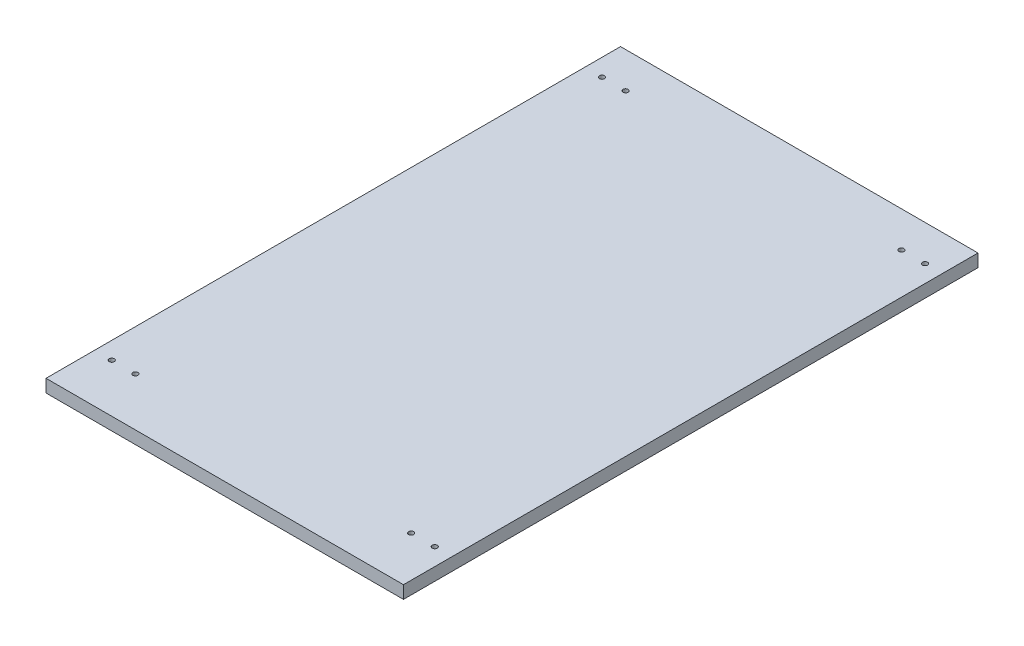
ISO-10303-21;
HEADER;
FILE_DESCRIPTION(('STEP AP214'),'2;1');
FILE_NAME('part.step','',(''),(''),'','','');
FILE_SCHEMA(('AUTOMOTIVE_DESIGN { 1 0 10303 214 1 1 1 1 }'));
ENDSEC;
DATA;
#1=APPLICATION_CONTEXT('core data for automotive mechanical design processes');
#2=APPLICATION_PROTOCOL_DEFINITION('international standard','automotive_design',2000,#1);
#3=PRODUCT_CONTEXT('',#1,'mechanical');
#4=PRODUCT('Part','Part','',(#3));
#5=PRODUCT_RELATED_PRODUCT_CATEGORY('part','',(#4));
#6=PRODUCT_DEFINITION_FORMATION('','',#4);
#7=PRODUCT_DEFINITION_CONTEXT('part definition',#1,'design');
#8=PRODUCT_DEFINITION('design','',#6,#7);
#9=PRODUCT_DEFINITION_SHAPE('','',#8);
#10=(LENGTH_UNIT() NAMED_UNIT(*) SI_UNIT(.MILLI.,.METRE.));
#11=(NAMED_UNIT(*) PLANE_ANGLE_UNIT() SI_UNIT($,.RADIAN.));
#12=(NAMED_UNIT(*) SI_UNIT($,.STERADIAN.) SOLID_ANGLE_UNIT());
#13=UNCERTAINTY_MEASURE_WITH_UNIT(LENGTH_MEASURE(1.E-05),#10,'distance_accuracy_value','');
#14=(GEOMETRIC_REPRESENTATION_CONTEXT(3) GLOBAL_UNCERTAINTY_ASSIGNED_CONTEXT((#13)) GLOBAL_UNIT_ASSIGNED_CONTEXT((#10,
#11,#12)) REPRESENTATION_CONTEXT('',''));
#15=CARTESIAN_POINT('',(0.,0.,0.));
#16=DIRECTION('',(0.,0.,1.));
#17=DIRECTION('',(1.,0.,0.));
#18=AXIS2_PLACEMENT_3D('',#15,#16,#17);
#19=CARTESIAN_POINT('',(0.,10.,0.));
#20=DIRECTION('',(-1.,0.,0.));
#21=DIRECTION('',(0.,0.,1.));
#22=AXIS2_PLACEMENT_3D('',#19,#20,#21);
#23=PLANE('',#22);
#24=DIRECTION('',(0.,0.,-1.));
#25=VECTOR('',#24,1.);
#26=CARTESIAN_POINT('',(0.,0.,0.));
#27=LINE('',#26,#25);
#28=CARTESIAN_POINT('',(0.,0.,0.));
#29=VERTEX_POINT('',#28);
#30=CARTESIAN_POINT('',(0.,0.,-450.));
#31=VERTEX_POINT('',#30);
#32=EDGE_CURVE('E100',#29,#31,#27,.T.);
#33=ORIENTED_EDGE('',*,*,#32,.T.);
#34=DIRECTION('',(0.,-1.,0.));
#35=VECTOR('',#34,1.);
#36=CARTESIAN_POINT('',(0.,10.,-450.));
#37=LINE('',#36,#35);
#38=CARTESIAN_POINT('',(0.,10.,-450.));
#39=VERTEX_POINT('',#38);
#40=EDGE_CURVE('E11',#39,#31,#37,.T.);
#41=ORIENTED_EDGE('',*,*,#40,.F.);
#42=DIRECTION('',(0.,0.,-1.));
#43=VECTOR('',#42,1.);
#44=CARTESIAN_POINT('',(0.,10.,0.));
#45=LINE('',#44,#43);
#46=CARTESIAN_POINT('',(0.,10.,0.));
#47=VERTEX_POINT('',#46);
#48=EDGE_CURVE('E88',#47,#39,#45,.T.);
#49=ORIENTED_EDGE('',*,*,#48,.F.);
#50=DIRECTION('',(0.,-1.,0.));
#51=VECTOR('',#50,1.);
#52=CARTESIAN_POINT('',(0.,10.,0.));
#53=LINE('',#52,#51);
#54=EDGE_CURVE('E96',#47,#29,#53,.T.);
#55=ORIENTED_EDGE('',*,*,#54,.T.);
#56=EDGE_LOOP('',(#33,#41,#49,#55));
#57=FACE_BOUND('',#56,.T.);
#58=ADVANCED_FACE('F37',(#57),#23,.F.);
#59=CARTESIAN_POINT('',(0.,10.,-450.));
#60=DIRECTION('',(0.,0.,1.));
#61=DIRECTION('',(1.,0.,0.));
#62=AXIS2_PLACEMENT_3D('',#59,#60,#61);
#63=PLANE('',#62);
#64=DIRECTION('',(-1.,0.,0.));
#65=VECTOR('',#64,1.);
#66=CARTESIAN_POINT('',(0.,0.,-450.));
#67=LINE('',#66,#65);
#68=CARTESIAN_POINT('',(-280.,0.,-450.));
#69=VERTEX_POINT('',#68);
#70=EDGE_CURVE('E92',#31,#69,#67,.T.);
#71=ORIENTED_EDGE('',*,*,#70,.T.);
#72=DIRECTION('',(0.,-1.,0.));
#73=VECTOR('',#72,1.);
#74=CARTESIAN_POINT('',(-280.,10.,-450.));
#75=LINE('',#74,#73);
#76=CARTESIAN_POINT('',(-280.,10.,-450.));
#77=VERTEX_POINT('',#76);
#78=EDGE_CURVE('E45',#77,#69,#75,.T.);
#79=ORIENTED_EDGE('',*,*,#78,.F.);
#80=DIRECTION('',(-1.,0.,0.));
#81=VECTOR('',#80,1.);
#82=CARTESIAN_POINT('',(0.,10.,-450.));
#83=LINE('',#82,#81);
#84=EDGE_CURVE('E83',#39,#77,#83,.T.);
#85=ORIENTED_EDGE('',*,*,#84,.F.);
#86=ORIENTED_EDGE('',*,*,#40,.T.);
#87=EDGE_LOOP('',(#71,#79,#85,#86));
#88=FACE_BOUND('',#87,.T.);
#89=ADVANCED_FACE('F91',(#88),#63,.F.);
#90=CARTESIAN_POINT('',(-280.,10.,0.));
#91=DIRECTION('',(1.,0.,0.));
#92=DIRECTION('',(0.,0.,-1.));
#93=AXIS2_PLACEMENT_3D('',#90,#91,#92);
#94=PLANE('',#93);
#95=DIRECTION('',(0.,0.,1.));
#96=VECTOR('',#95,1.);
#97=CARTESIAN_POINT('',(-280.,0.,0.));
#98=LINE('',#97,#96);
#99=CARTESIAN_POINT('',(-280.,0.,0.));
#100=VERTEX_POINT('',#99);
#101=EDGE_CURVE('E70',#69,#100,#98,.T.);
#102=ORIENTED_EDGE('',*,*,#101,.T.);
#103=DIRECTION('',(0.,-1.,0.));
#104=VECTOR('',#103,1.);
#105=CARTESIAN_POINT('',(-280.,10.,0.));
#106=LINE('',#105,#104);
#107=CARTESIAN_POINT('',(-280.,10.,0.));
#108=VERTEX_POINT('',#107);
#109=EDGE_CURVE('E93',#108,#100,#106,.T.);
#110=ORIENTED_EDGE('',*,*,#109,.F.);
#111=DIRECTION('',(0.,0.,1.));
#112=VECTOR('',#111,1.);
#113=CARTESIAN_POINT('',(-280.,10.,0.));
#114=LINE('',#113,#112);
#115=EDGE_CURVE('E86',#77,#108,#114,.T.);
#116=ORIENTED_EDGE('',*,*,#115,.F.);
#117=ORIENTED_EDGE('',*,*,#78,.T.);
#118=EDGE_LOOP('',(#102,#110,#116,#117));
#119=FACE_BOUND('',#118,.T.);
#120=ADVANCED_FACE('F94',(#119),#94,.F.);
#121=CARTESIAN_POINT('',(0.,10.,0.));
#122=DIRECTION('',(0.,0.,-1.));
#123=DIRECTION('',(-1.,0.,0.));
#124=AXIS2_PLACEMENT_3D('',#121,#122,#123);
#125=PLANE('',#124);
#126=DIRECTION('',(1.,0.,0.));
#127=VECTOR('',#126,1.);
#128=CARTESIAN_POINT('',(0.,0.,0.));
#129=LINE('',#128,#127);
#130=EDGE_CURVE('E76',#100,#29,#129,.T.);
#131=ORIENTED_EDGE('',*,*,#130,.T.);
#132=ORIENTED_EDGE('',*,*,#54,.F.);
#133=DIRECTION('',(1.,0.,0.));
#134=VECTOR('',#133,1.);
#135=CARTESIAN_POINT('',(0.,10.,0.));
#136=LINE('',#135,#134);
#137=EDGE_CURVE('E53',#108,#47,#136,.T.);
#138=ORIENTED_EDGE('',*,*,#137,.F.);
#139=ORIENTED_EDGE('',*,*,#109,.T.);
#140=EDGE_LOOP('',(#131,#132,#138,#139));
#141=FACE_BOUND('',#140,.T.);
#142=ADVANCED_FACE('F108',(#141),#125,.F.);
#143=CARTESIAN_POINT('',(0.,10.,0.));
#144=DIRECTION('',(0.,1.,0.));
#145=DIRECTION('',(0.,0.,1.));
#146=AXIS2_PLACEMENT_3D('',#143,#144,#145);
#147=PLANE('',#146);
#148=CARTESIAN_POINT('',(-248.,10.,-38.));
#149=DIRECTION('',(0.,1.,0.));
#150=DIRECTION('',(0.,0.,1.));
#151=AXIS2_PLACEMENT_3D('',#148,#149,#150);
#152=CIRCLE('',#151,2.);
#153=CARTESIAN_POINT('',(-248.,10.,-36.));
#154=VERTEX_POINT('',#153);
#155=EDGE_CURVE('E117',#154,#154,#152,.T.);
#156=ORIENTED_EDGE('',*,*,#155,.F.);
#157=EDGE_LOOP('',(#156));
#158=FACE_BOUND('',#157,.T.);
#159=CARTESIAN_POINT('',(-32.0000000000001,10.,-38.));
#160=DIRECTION('',(0.,1.,0.));
#161=DIRECTION('',(0.,0.,1.));
#162=AXIS2_PLACEMENT_3D('',#159,#160,#161);
#163=CIRCLE('',#162,2.);
#164=CARTESIAN_POINT('',(-32.0000000000001,10.,-36.));
#165=VERTEX_POINT('',#164);
#166=EDGE_CURVE('E136',#165,#165,#163,.T.);
#167=ORIENTED_EDGE('',*,*,#166,.F.);
#168=EDGE_LOOP('',(#167));
#169=FACE_BOUND('',#168,.T.);
#170=CARTESIAN_POINT('',(-13.5000000000001,10.,-38.));
#171=DIRECTION('',(0.,1.,0.));
#172=DIRECTION('',(0.,0.,1.));
#173=AXIS2_PLACEMENT_3D('',#170,#171,#172);
#174=CIRCLE('',#173,2.);
#175=CARTESIAN_POINT('',(-13.5000000000001,10.,-36.));
#176=VERTEX_POINT('',#175);
#177=EDGE_CURVE('E130',#176,#176,#174,.T.);
#178=ORIENTED_EDGE('',*,*,#177,.F.);
#179=EDGE_LOOP('',(#178));
#180=FACE_BOUND('',#179,.T.);
#181=CARTESIAN_POINT('',(-13.5,10.,-422.));
#182=DIRECTION('',(0.,1.,0.));
#183=DIRECTION('',(0.,0.,1.));
#184=AXIS2_PLACEMENT_3D('',#181,#182,#183);
#185=CIRCLE('',#184,2.);
#186=CARTESIAN_POINT('',(-13.5,10.,-420.));
#187=VERTEX_POINT('',#186);
#188=EDGE_CURVE('E123',#187,#187,#185,.T.);
#189=ORIENTED_EDGE('',*,*,#188,.F.);
#190=EDGE_LOOP('',(#189));
#191=FACE_BOUND('',#190,.T.);
#192=CARTESIAN_POINT('',(-248.,10.,-422.));
#193=DIRECTION('',(0.,1.,0.));
#194=DIRECTION('',(0.,0.,1.));
#195=AXIS2_PLACEMENT_3D('',#192,#193,#194);
#196=CIRCLE('',#195,2.);
#197=CARTESIAN_POINT('',(-248.,10.,-420.));
#198=VERTEX_POINT('',#197);
#199=EDGE_CURVE('E148',#198,#198,#196,.T.);
#200=ORIENTED_EDGE('',*,*,#199,.F.);
#201=EDGE_LOOP('',(#200));
#202=FACE_BOUND('',#201,.T.);
#203=CARTESIAN_POINT('',(-266.5,10.,-422.));
#204=DIRECTION('',(0.,1.,0.));
#205=DIRECTION('',(0.,0.,1.));
#206=AXIS2_PLACEMENT_3D('',#203,#204,#205);
#207=CIRCLE('',#206,2.);
#208=CARTESIAN_POINT('',(-266.5,10.,-420.));
#209=VERTEX_POINT('',#208);
#210=EDGE_CURVE('E147',#209,#209,#207,.T.);
#211=ORIENTED_EDGE('',*,*,#210,.F.);
#212=EDGE_LOOP('',(#211));
#213=FACE_BOUND('',#212,.T.);
#214=CARTESIAN_POINT('',(-32.,10.,-422.));
#215=DIRECTION('',(0.,1.,0.));
#216=DIRECTION('',(0.,0.,1.));
#217=AXIS2_PLACEMENT_3D('',#214,#215,#216);
#218=CIRCLE('',#217,2.);
#219=CARTESIAN_POINT('',(-32.,10.,-420.));
#220=VERTEX_POINT('',#219);
#221=EDGE_CURVE('E124',#220,#220,#218,.T.);
#222=ORIENTED_EDGE('',*,*,#221,.F.);
#223=EDGE_LOOP('',(#222));
#224=FACE_BOUND('',#223,.T.);
#225=CARTESIAN_POINT('',(-266.5,10.,-38.));
#226=DIRECTION('',(0.,1.,0.));
#227=DIRECTION('',(0.,0.,1.));
#228=AXIS2_PLACEMENT_3D('',#225,#226,#227);
#229=CIRCLE('',#228,2.);
#230=CARTESIAN_POINT('',(-266.5,10.,-36.));
#231=VERTEX_POINT('',#230);
#232=EDGE_CURVE('E114',#231,#231,#229,.T.);
#233=ORIENTED_EDGE('',*,*,#232,.F.);
#234=EDGE_LOOP('',(#233));
#235=FACE_BOUND('',#234,.T.);
#236=ORIENTED_EDGE('',*,*,#48,.T.);
#237=ORIENTED_EDGE('',*,*,#84,.T.);
#238=ORIENTED_EDGE('',*,*,#115,.T.);
#239=ORIENTED_EDGE('',*,*,#137,.T.);
#240=EDGE_LOOP('',(#236,#237,#238,#239));
#241=FACE_BOUND('',#240,.T.);
#242=ADVANCED_FACE('F84',(#158,#169,#180,#191,#202,#213,#224,#235,#241),#147,.T.);
#243=CARTESIAN_POINT('',(0.,0.,0.));
#244=DIRECTION('',(0.,1.,0.));
#245=DIRECTION('',(0.,0.,1.));
#246=AXIS2_PLACEMENT_3D('',#243,#244,#245);
#247=PLANE('',#246);
#248=CARTESIAN_POINT('',(-248.,0.,-38.));
#249=DIRECTION('',(0.,1.,0.));
#250=DIRECTION('',(0.,0.,1.));
#251=AXIS2_PLACEMENT_3D('',#248,#249,#250);
#252=CIRCLE('',#251,2.);
#253=CARTESIAN_POINT('',(-248.,0.,-36.));
#254=VERTEX_POINT('',#253);
#255=EDGE_CURVE('E139',#254,#254,#252,.T.);
#256=ORIENTED_EDGE('',*,*,#255,.T.);
#257=EDGE_LOOP('',(#256));
#258=FACE_BOUND('',#257,.T.);
#259=CARTESIAN_POINT('',(-32.0000000000001,0.,-38.));
#260=DIRECTION('',(0.,1.,0.));
#261=DIRECTION('',(0.,0.,1.));
#262=AXIS2_PLACEMENT_3D('',#259,#260,#261);
#263=CIRCLE('',#262,2.);
#264=CARTESIAN_POINT('',(-32.0000000000001,0.,-36.));
#265=VERTEX_POINT('',#264);
#266=EDGE_CURVE('E133',#265,#265,#263,.T.);
#267=ORIENTED_EDGE('',*,*,#266,.T.);
#268=EDGE_LOOP('',(#267));
#269=FACE_BOUND('',#268,.T.);
#270=CARTESIAN_POINT('',(-13.5000000000001,0.,-38.));
#271=DIRECTION('',(0.,1.,0.));
#272=DIRECTION('',(0.,0.,1.));
#273=AXIS2_PLACEMENT_3D('',#270,#271,#272);
#274=CIRCLE('',#273,2.);
#275=CARTESIAN_POINT('',(-13.5000000000001,0.,-36.));
#276=VERTEX_POINT('',#275);
#277=EDGE_CURVE('E127',#276,#276,#274,.T.);
#278=ORIENTED_EDGE('',*,*,#277,.T.);
#279=EDGE_LOOP('',(#278));
#280=FACE_BOUND('',#279,.T.);
#281=CARTESIAN_POINT('',(-13.5,0.,-422.));
#282=DIRECTION('',(0.,1.,0.));
#283=DIRECTION('',(0.,0.,1.));
#284=AXIS2_PLACEMENT_3D('',#281,#282,#283);
#285=CIRCLE('',#284,2.);
#286=CARTESIAN_POINT('',(-13.5,0.,-420.));
#287=VERTEX_POINT('',#286);
#288=EDGE_CURVE('E120',#287,#287,#285,.T.);
#289=ORIENTED_EDGE('',*,*,#288,.T.);
#290=EDGE_LOOP('',(#289));
#291=FACE_BOUND('',#290,.T.);
#292=CARTESIAN_POINT('',(-248.,0.,-422.));
#293=DIRECTION('',(0.,1.,0.));
#294=DIRECTION('',(0.,0.,1.));
#295=AXIS2_PLACEMENT_3D('',#292,#293,#294);
#296=CIRCLE('',#295,2.);
#297=CARTESIAN_POINT('',(-248.,0.,-420.));
#298=VERTEX_POINT('',#297);
#299=EDGE_CURVE('E156',#298,#298,#296,.T.);
#300=ORIENTED_EDGE('',*,*,#299,.T.);
#301=EDGE_LOOP('',(#300));
#302=FACE_BOUND('',#301,.T.);
#303=CARTESIAN_POINT('',(-266.5,0.,-422.));
#304=DIRECTION('',(0.,1.,0.));
#305=DIRECTION('',(0.,0.,1.));
#306=AXIS2_PLACEMENT_3D('',#303,#304,#305);
#307=CIRCLE('',#306,2.);
#308=CARTESIAN_POINT('',(-266.5,0.,-420.));
#309=VERTEX_POINT('',#308);
#310=EDGE_CURVE('E144',#309,#309,#307,.T.);
#311=ORIENTED_EDGE('',*,*,#310,.T.);
#312=EDGE_LOOP('',(#311));
#313=FACE_BOUND('',#312,.T.);
#314=CARTESIAN_POINT('',(-32.,0.,-422.));
#315=DIRECTION('',(0.,1.,0.));
#316=DIRECTION('',(0.,0.,1.));
#317=AXIS2_PLACEMENT_3D('',#314,#315,#316);
#318=CIRCLE('',#317,2.);
#319=CARTESIAN_POINT('',(-32.,0.,-420.));
#320=VERTEX_POINT('',#319);
#321=EDGE_CURVE('E151',#320,#320,#318,.T.);
#322=ORIENTED_EDGE('',*,*,#321,.T.);
#323=EDGE_LOOP('',(#322));
#324=FACE_BOUND('',#323,.T.);
#325=CARTESIAN_POINT('',(-266.5,0.,-38.));
#326=DIRECTION('',(0.,1.,0.));
#327=DIRECTION('',(0.,0.,1.));
#328=AXIS2_PLACEMENT_3D('',#325,#326,#327);
#329=CIRCLE('',#328,2.);
#330=CARTESIAN_POINT('',(-266.5,0.,-36.));
#331=VERTEX_POINT('',#330);
#332=EDGE_CURVE('E103',#331,#331,#329,.T.);
#333=ORIENTED_EDGE('',*,*,#332,.T.);
#334=EDGE_LOOP('',(#333));
#335=FACE_BOUND('',#334,.T.);
#336=ORIENTED_EDGE('',*,*,#32,.F.);
#337=ORIENTED_EDGE('',*,*,#130,.F.);
#338=ORIENTED_EDGE('',*,*,#101,.F.);
#339=ORIENTED_EDGE('',*,*,#70,.F.);
#340=EDGE_LOOP('',(#336,#337,#338,#339));
#341=FACE_BOUND('',#340,.T.);
#342=ADVANCED_FACE('F111',(#258,#269,#280,#291,#302,#313,#324,#335,#341),#247,.F.);
#343=CARTESIAN_POINT('',(-266.5,0.,-38.));
#344=DIRECTION('',(0.,1.,0.));
#345=DIRECTION('',(0.,0.,1.));
#346=AXIS2_PLACEMENT_3D('',#343,#344,#345);
#347=CYLINDRICAL_SURFACE('',#346,2.);
#348=ORIENTED_EDGE('',*,*,#332,.F.);
#349=EDGE_LOOP('',(#348));
#350=FACE_BOUND('',#349,.T.);
#351=ORIENTED_EDGE('',*,*,#232,.T.);
#352=EDGE_LOOP('',(#351));
#353=FACE_BOUND('',#352,.T.);
#354=ADVANCED_FACE('F174',(#350,#353),#347,.F.);
#355=CARTESIAN_POINT('',(-32.,0.,-422.));
#356=DIRECTION('',(0.,1.,0.));
#357=DIRECTION('',(0.,0.,1.));
#358=AXIS2_PLACEMENT_3D('',#355,#356,#357);
#359=CYLINDRICAL_SURFACE('',#358,2.);
#360=ORIENTED_EDGE('',*,*,#321,.F.);
#361=EDGE_LOOP('',(#360));
#362=FACE_BOUND('',#361,.T.);
#363=ORIENTED_EDGE('',*,*,#221,.T.);
#364=EDGE_LOOP('',(#363));
#365=FACE_BOUND('',#364,.T.);
#366=ADVANCED_FACE('F176',(#362,#365),#359,.F.);
#367=CARTESIAN_POINT('',(-266.5,0.,-422.));
#368=DIRECTION('',(0.,1.,0.));
#369=DIRECTION('',(0.,0.,1.));
#370=AXIS2_PLACEMENT_3D('',#367,#368,#369);
#371=CYLINDRICAL_SURFACE('',#370,2.);
#372=ORIENTED_EDGE('',*,*,#310,.F.);
#373=EDGE_LOOP('',(#372));
#374=FACE_BOUND('',#373,.T.);
#375=ORIENTED_EDGE('',*,*,#210,.T.);
#376=EDGE_LOOP('',(#375));
#377=FACE_BOUND('',#376,.T.);
#378=ADVANCED_FACE('F183',(#374,#377),#371,.F.);
#379=CARTESIAN_POINT('',(-248.,0.,-422.));
#380=DIRECTION('',(0.,1.,0.));
#381=DIRECTION('',(0.,0.,1.));
#382=AXIS2_PLACEMENT_3D('',#379,#380,#381);
#383=CYLINDRICAL_SURFACE('',#382,2.);
#384=ORIENTED_EDGE('',*,*,#299,.F.);
#385=EDGE_LOOP('',(#384));
#386=FACE_BOUND('',#385,.T.);
#387=ORIENTED_EDGE('',*,*,#199,.T.);
#388=EDGE_LOOP('',(#387));
#389=FACE_BOUND('',#388,.T.);
#390=ADVANCED_FACE('F162',(#386,#389),#383,.F.);
#391=CARTESIAN_POINT('',(-13.5,0.,-422.));
#392=DIRECTION('',(0.,1.,0.));
#393=DIRECTION('',(0.,0.,1.));
#394=AXIS2_PLACEMENT_3D('',#391,#392,#393);
#395=CYLINDRICAL_SURFACE('',#394,2.);
#396=ORIENTED_EDGE('',*,*,#288,.F.);
#397=EDGE_LOOP('',(#396));
#398=FACE_BOUND('',#397,.T.);
#399=ORIENTED_EDGE('',*,*,#188,.T.);
#400=EDGE_LOOP('',(#399));
#401=FACE_BOUND('',#400,.T.);
#402=ADVANCED_FACE('F244',(#398,#401),#395,.F.);
#403=CARTESIAN_POINT('',(-13.5000000000001,0.,-38.));
#404=DIRECTION('',(0.,1.,0.));
#405=DIRECTION('',(0.,0.,1.));
#406=AXIS2_PLACEMENT_3D('',#403,#404,#405);
#407=CYLINDRICAL_SURFACE('',#406,2.);
#408=ORIENTED_EDGE('',*,*,#277,.F.);
#409=EDGE_LOOP('',(#408));
#410=FACE_BOUND('',#409,.T.);
#411=ORIENTED_EDGE('',*,*,#177,.T.);
#412=EDGE_LOOP('',(#411));
#413=FACE_BOUND('',#412,.T.);
#414=ADVANCED_FACE('F255',(#410,#413),#407,.F.);
#415=CARTESIAN_POINT('',(-32.0000000000001,0.,-38.));
#416=DIRECTION('',(0.,1.,0.));
#417=DIRECTION('',(0.,0.,1.));
#418=AXIS2_PLACEMENT_3D('',#415,#416,#417);
#419=CYLINDRICAL_SURFACE('',#418,2.);
#420=ORIENTED_EDGE('',*,*,#266,.F.);
#421=EDGE_LOOP('',(#420));
#422=FACE_BOUND('',#421,.T.);
#423=ORIENTED_EDGE('',*,*,#166,.T.);
#424=EDGE_LOOP('',(#423));
#425=FACE_BOUND('',#424,.T.);
#426=ADVANCED_FACE('F265',(#422,#425),#419,.F.);
#427=CARTESIAN_POINT('',(-248.,0.,-38.));
#428=DIRECTION('',(0.,1.,0.));
#429=DIRECTION('',(0.,0.,1.));
#430=AXIS2_PLACEMENT_3D('',#427,#428,#429);
#431=CYLINDRICAL_SURFACE('',#430,2.);
#432=ORIENTED_EDGE('',*,*,#255,.F.);
#433=EDGE_LOOP('',(#432));
#434=FACE_BOUND('',#433,.T.);
#435=ORIENTED_EDGE('',*,*,#155,.T.);
#436=EDGE_LOOP('',(#435));
#437=FACE_BOUND('',#436,.T.);
#438=ADVANCED_FACE('F276',(#434,#437),#431,.F.);
#439=CLOSED_SHELL('',(#58,#89,#120,#142,#242,#342,#354,#366,#378,#390,#402,#414,#426,#438));
#440=MANIFOLD_SOLID_BREP('B2',#439);
#441=ADVANCED_BREP_SHAPE_REPRESENTATION('',(#18,#440),#14);
#442=SHAPE_DEFINITION_REPRESENTATION(#9,#441);
ENDSEC;
END-ISO-10303-21;
